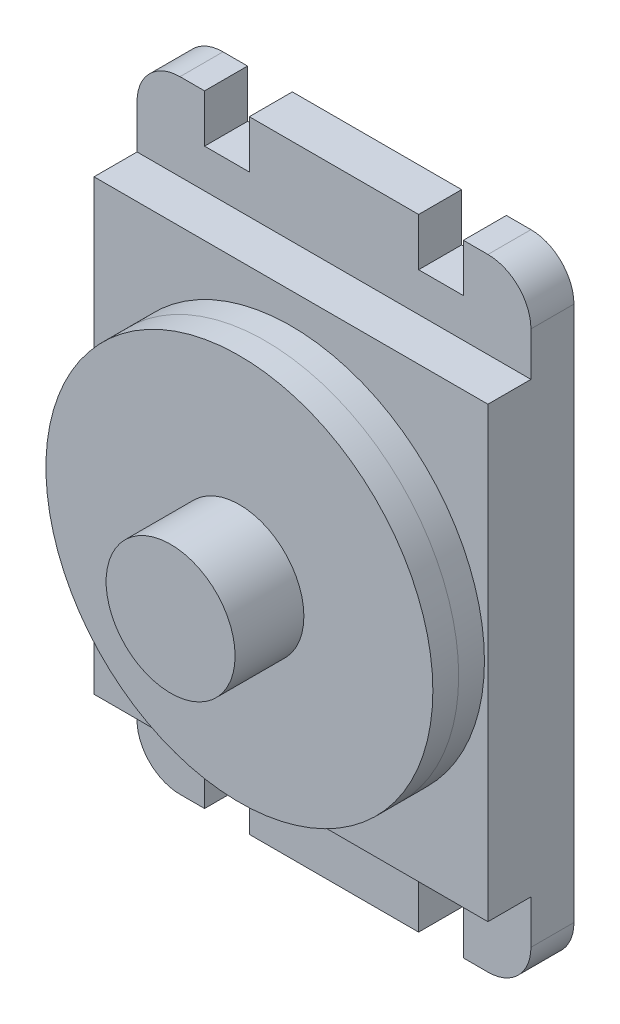
ISO-10303-21;
HEADER;
FILE_DESCRIPTION(('STEP AP214'),'2;1');
FILE_NAME('part.step','',(''),(''),'','','');
FILE_SCHEMA(('AUTOMOTIVE_DESIGN { 1 0 10303 214 1 1 1 1 }'));
ENDSEC;
DATA;
#1=APPLICATION_CONTEXT('core data for automotive mechanical design processes');
#2=APPLICATION_PROTOCOL_DEFINITION('international standard','automotive_design',2000,#1);
#3=PRODUCT_CONTEXT('',#1,'mechanical');
#4=PRODUCT('Part','Part','',(#3));
#5=PRODUCT_RELATED_PRODUCT_CATEGORY('part','',(#4));
#6=PRODUCT_DEFINITION_FORMATION('','',#4);
#7=PRODUCT_DEFINITION_CONTEXT('part definition',#1,'design');
#8=PRODUCT_DEFINITION('design','',#6,#7);
#9=PRODUCT_DEFINITION_SHAPE('','',#8);
#10=(LENGTH_UNIT() NAMED_UNIT(*) SI_UNIT(.MILLI.,.METRE.));
#11=(NAMED_UNIT(*) PLANE_ANGLE_UNIT() SI_UNIT($,.RADIAN.));
#12=(NAMED_UNIT(*) SI_UNIT($,.STERADIAN.) SOLID_ANGLE_UNIT());
#13=UNCERTAINTY_MEASURE_WITH_UNIT(LENGTH_MEASURE(1.E-05),#10,'distance_accuracy_value','');
#14=(GEOMETRIC_REPRESENTATION_CONTEXT(3) GLOBAL_UNCERTAINTY_ASSIGNED_CONTEXT((#13)) GLOBAL_UNIT_ASSIGNED_CONTEXT((#10,
#11,#12)) REPRESENTATION_CONTEXT('',''));
#15=CARTESIAN_POINT('',(0.,0.,0.));
#16=DIRECTION('',(0.,0.,1.));
#17=DIRECTION('',(1.,0.,0.));
#18=AXIS2_PLACEMENT_3D('',#15,#16,#17);
#19=CARTESIAN_POINT('',(-55.0000000000003,-2.19767780362812E-13,16.));
#20=DIRECTION('',(0.,0.,-1.));
#21=DIRECTION('',(-1.,0.,0.));
#22=AXIS2_PLACEMENT_3D('',#19,#20,#21);
#23=CYLINDRICAL_SURFACE('',#22,22.5);
#24=CARTESIAN_POINT('',(-55.0000000000003,-2.19767780362812E-13,16.));
#25=DIRECTION('',(0.,0.,1.));
#26=DIRECTION('',(1.,0.,0.));
#27=AXIS2_PLACEMENT_3D('',#24,#25,#26);
#28=CIRCLE('',#27,22.5);
#29=CARTESIAN_POINT('',(-32.5000000000003,-2.19767780362812E-13,16.));
#30=VERTEX_POINT('',#29);
#31=EDGE_CURVE('E51',#30,#30,#28,.T.);
#32=ORIENTED_EDGE('',*,*,#31,.F.);
#33=EDGE_LOOP('',(#32));
#34=FACE_BOUND('',#33,.T.);
#35=CARTESIAN_POINT('',(-55.0000000000003,-2.19767780362812E-13,13.));
#36=DIRECTION('',(0.,0.,1.));
#37=DIRECTION('',(1.,0.,0.));
#38=AXIS2_PLACEMENT_3D('',#35,#36,#37);
#39=CIRCLE('',#38,22.5);
#40=CARTESIAN_POINT('',(-32.5000000000003,-2.19767780362812E-13,13.));
#41=VERTEX_POINT('',#40);
#42=EDGE_CURVE('E47',#41,#41,#39,.T.);
#43=ORIENTED_EDGE('',*,*,#42,.T.);
#44=EDGE_LOOP('',(#43));
#45=FACE_BOUND('',#44,.T.);
#46=ADVANCED_FACE('F44',(#34,#45),#23,.T.);
#47=CARTESIAN_POINT('',(-55.0000000000003,-2.19767780362812E-13,16.));
#48=DIRECTION('',(0.,0.,1.));
#49=DIRECTION('',(1.,0.,0.));
#50=AXIS2_PLACEMENT_3D('',#47,#48,#49);
#51=PLANE('',#50);
#52=CARTESIAN_POINT('',(-55.0000000000003,-2.19767780362812E-13,16.));
#53=DIRECTION('',(0.,0.,1.));
#54=DIRECTION('',(1.,0.,0.));
#55=AXIS2_PLACEMENT_3D('',#52,#53,#54);
#56=CIRCLE('',#55,7.5);
#57=CARTESIAN_POINT('',(-47.5000000000003,-2.19767780362812E-13,16.));
#58=VERTEX_POINT('',#57);
#59=EDGE_CURVE('E11',#58,#58,#56,.T.);
#60=ORIENTED_EDGE('',*,*,#59,.F.);
#61=EDGE_LOOP('',(#60));
#62=FACE_BOUND('',#61,.T.);
#63=ORIENTED_EDGE('',*,*,#31,.T.);
#64=EDGE_LOOP('',(#63));
#65=FACE_BOUND('',#64,.T.);
#66=ADVANCED_FACE('F68',(#62,#65),#51,.T.);
#67=CARTESIAN_POINT('',(-55.0000000000003,-2.19767780362812E-13,13.));
#68=DIRECTION('',(0.,0.,1.));
#69=DIRECTION('',(1.,0.,0.));
#70=AXIS2_PLACEMENT_3D('',#67,#68,#69);
#71=PLANE('',#70);
#72=ORIENTED_EDGE('',*,*,#42,.F.);
#73=EDGE_LOOP('',(#72));
#74=FACE_BOUND('',#73,.T.);
#75=ADVANCED_FACE('F65',(#74),#71,.F.);
#76=CARTESIAN_POINT('',(-55.0000000000003,-2.19767780362812E-13,24.));
#77=DIRECTION('',(0.,0.,-1.));
#78=DIRECTION('',(-1.,0.,0.));
#79=AXIS2_PLACEMENT_3D('',#76,#77,#78);
#80=CYLINDRICAL_SURFACE('',#79,7.5);
#81=CARTESIAN_POINT('',(-55.0000000000003,-2.19767780362812E-13,24.));
#82=DIRECTION('',(0.,0.,1.));
#83=DIRECTION('',(1.,0.,0.));
#84=AXIS2_PLACEMENT_3D('',#81,#82,#83);
#85=CIRCLE('',#84,7.5);
#86=CARTESIAN_POINT('',(-47.5000000000003,-2.19767780362812E-13,24.));
#87=VERTEX_POINT('',#86);
#88=EDGE_CURVE('E57',#87,#87,#85,.T.);
#89=ORIENTED_EDGE('',*,*,#88,.F.);
#90=EDGE_LOOP('',(#89));
#91=FACE_BOUND('',#90,.T.);
#92=ORIENTED_EDGE('',*,*,#59,.T.);
#93=EDGE_LOOP('',(#92));
#94=FACE_BOUND('',#93,.T.);
#95=ADVANCED_FACE('F67',(#91,#94),#80,.T.);
#96=CARTESIAN_POINT('',(-55.0000000000003,-2.19767780362812E-13,24.));
#97=DIRECTION('',(0.,0.,1.));
#98=DIRECTION('',(1.,0.,0.));
#99=AXIS2_PLACEMENT_3D('',#96,#97,#98);
#100=PLANE('',#99);
#101=ORIENTED_EDGE('',*,*,#88,.T.);
#102=EDGE_LOOP('',(#101));
#103=FACE_BOUND('',#102,.T.);
#104=ADVANCED_FACE('F73',(#103),#100,.T.);
#105=CLOSED_SHELL('',(#46,#66,#75,#95,#104));
#106=MANIFOLD_SOLID_BREP('B2',#105);
#107=CARTESIAN_POINT('',(-37.0949203281673,31.1416620367931,5.));
#108=DIRECTION('',(0.,0.,1.));
#109=DIRECTION('',(1.,0.,0.));
#110=AXIS2_PLACEMENT_3D('',#107,#108,#109);
#111=PLANE('',#110);
#112=DIRECTION('',(1.,0.,0.));
#113=VECTOR('',#112,1.);
#114=CARTESIAN_POINT('',(-77.9050796718332,-26.0594506606891,5.));
#115=LINE('',#114,#113);
#116=CARTESIAN_POINT('',(-77.9050796718329,-26.0594506606891,5.));
#117=VERTEX_POINT('',#116);
#118=CARTESIAN_POINT('',(-32.0949203281673,-26.0594506606891,5.));
#119=VERTEX_POINT('',#118);
#120=EDGE_CURVE('E319',#117,#119,#115,.T.);
#121=ORIENTED_EDGE('',*,*,#120,.F.);
#122=DIRECTION('',(0.,-1.,0.));
#123=VECTOR('',#122,1.);
#124=CARTESIAN_POINT('',(-77.9050796718329,31.1416620367931,5.));
#125=LINE('',#124,#123);
#126=CARTESIAN_POINT('',(-77.9050796718329,-31.141662036793,5.));
#127=VERTEX_POINT('',#126);
#128=EDGE_CURVE('E339',#117,#127,#125,.T.);
#129=ORIENTED_EDGE('',*,*,#128,.T.);
#130=CARTESIAN_POINT('',(-72.9050796718329,-31.1416620367931,5.));
#131=DIRECTION('',(0.,0.,1.));
#132=DIRECTION('',(1.,0.,0.));
#133=AXIS2_PLACEMENT_3D('',#130,#131,#132);
#134=CIRCLE('',#133,5.);
#135=CARTESIAN_POINT('',(-72.9050796718329,-36.1416620367931,5.));
#136=VERTEX_POINT('',#135);
#137=EDGE_CURVE('E342',#127,#136,#134,.T.);
#138=ORIENTED_EDGE('',*,*,#137,.T.);
#139=DIRECTION('',(1.,0.,0.));
#140=VECTOR('',#139,1.);
#141=CARTESIAN_POINT('',(-72.9050796718329,-36.1416620367931,5.));
#142=LINE('',#141,#140);
#143=CARTESIAN_POINT('',(-70.0486055710375,-36.1416620367931,5.));
#144=VERTEX_POINT('',#143);
#145=EDGE_CURVE('E344',#136,#144,#142,.T.);
#146=ORIENTED_EDGE('',*,*,#145,.T.);
#147=DIRECTION('',(0.,1.,0.));
#148=VECTOR('',#147,1.);
#149=CARTESIAN_POINT('',(-70.0486055710375,-36.1416620367931,5.));
#150=LINE('',#149,#148);
#151=CARTESIAN_POINT('',(-70.0486055710375,-30.5715250808507,5.));
#152=VERTEX_POINT('',#151);
#153=EDGE_CURVE('E346',#144,#152,#150,.T.);
#154=ORIENTED_EDGE('',*,*,#153,.T.);
#155=DIRECTION('',(1.,0.,0.));
#156=VECTOR('',#155,1.);
#157=CARTESIAN_POINT('',(-70.0486055710375,-30.5715250808507,5.));
#158=LINE('',#157,#156);
#159=CARTESIAN_POINT('',(-64.8451738402919,-30.5715250808507,5.));
#160=VERTEX_POINT('',#159);
#161=EDGE_CURVE('E348',#152,#160,#158,.T.);
#162=ORIENTED_EDGE('',*,*,#161,.T.);
#163=DIRECTION('',(0.,-1.,0.));
#164=VECTOR('',#163,1.);
#165=CARTESIAN_POINT('',(-64.8451738402919,-30.5715250808507,5.));
#166=LINE('',#165,#164);
#167=CARTESIAN_POINT('',(-64.8451738402919,-36.1416620367931,5.));
#168=VERTEX_POINT('',#167);
#169=EDGE_CURVE('E350',#160,#168,#166,.T.);
#170=ORIENTED_EDGE('',*,*,#169,.T.);
#171=DIRECTION('',(1.,0.,0.));
#172=VECTOR('',#171,1.);
#173=CARTESIAN_POINT('',(-64.8451738402919,-36.1416620367931,5.));
#174=LINE('',#173,#172);
#175=CARTESIAN_POINT('',(-45.1548261597086,-36.1416620367931,5.));
#176=VERTEX_POINT('',#175);
#177=EDGE_CURVE('E352',#168,#176,#174,.T.);
#178=ORIENTED_EDGE('',*,*,#177,.T.);
#179=DIRECTION('',(0.,1.,0.));
#180=VECTOR('',#179,1.);
#181=CARTESIAN_POINT('',(-45.1548261597086,-30.5715250808507,5.));
#182=LINE('',#181,#180);
#183=CARTESIAN_POINT('',(-45.1548261597086,-30.5715250808507,5.));
#184=VERTEX_POINT('',#183);
#185=EDGE_CURVE('E354',#176,#184,#182,.T.);
#186=ORIENTED_EDGE('',*,*,#185,.T.);
#187=DIRECTION('',(1.,0.,0.));
#188=VECTOR('',#187,1.);
#189=CARTESIAN_POINT('',(-39.951394428963,-30.5715250808507,5.));
#190=LINE('',#189,#188);
#191=CARTESIAN_POINT('',(-39.951394428963,-30.5715250808507,5.));
#192=VERTEX_POINT('',#191);
#193=EDGE_CURVE('E356',#184,#192,#190,.T.);
#194=ORIENTED_EDGE('',*,*,#193,.T.);
#195=DIRECTION('',(0.,-1.,0.));
#196=VECTOR('',#195,1.);
#197=CARTESIAN_POINT('',(-39.951394428963,-36.1416620367931,5.));
#198=LINE('',#197,#196);
#199=CARTESIAN_POINT('',(-39.951394428963,-36.1416620367931,5.));
#200=VERTEX_POINT('',#199);
#201=EDGE_CURVE('E358',#192,#200,#198,.T.);
#202=ORIENTED_EDGE('',*,*,#201,.T.);
#203=DIRECTION('',(1.,0.,0.));
#204=VECTOR('',#203,1.);
#205=CARTESIAN_POINT('',(-39.951394428963,-36.1416620367931,5.));
#206=LINE('',#205,#204);
#207=CARTESIAN_POINT('',(-37.0949203281673,-36.1416620367931,5.));
#208=VERTEX_POINT('',#207);
#209=EDGE_CURVE('E360',#200,#208,#206,.T.);
#210=ORIENTED_EDGE('',*,*,#209,.T.);
#211=CARTESIAN_POINT('',(-37.0949203281673,-31.1416620367931,5.));
#212=DIRECTION('',(0.,0.,1.));
#213=DIRECTION('',(-1.,0.,0.));
#214=AXIS2_PLACEMENT_3D('',#211,#212,#213);
#215=CIRCLE('',#214,5.);
#216=CARTESIAN_POINT('',(-32.0949203281673,-31.1416620367931,5.));
#217=VERTEX_POINT('',#216);
#218=EDGE_CURVE('E362',#208,#217,#215,.T.);
#219=ORIENTED_EDGE('',*,*,#218,.T.);
#220=DIRECTION('',(0.,1.,0.));
#221=VECTOR('',#220,1.);
#222=CARTESIAN_POINT('',(-32.0949203281673,31.1416620367931,5.));
#223=LINE('',#222,#221);
#224=EDGE_CURVE('E138',#217,#119,#223,.T.);
#225=ORIENTED_EDGE('',*,*,#224,.T.);
#226=EDGE_LOOP('',(#121,#129,#138,#146,#154,#162,#170,#178,#186,#194,#202,#210,#219,#225));
#227=FACE_BOUND('',#226,.T.);
#228=ADVANCED_FACE('F115',(#227),#111,.T.);
#229=CARTESIAN_POINT('',(-72.9050796718329,36.1416620367931,5.));
#230=DIRECTION('',(0.,-1.,0.));
#231=DIRECTION('',(0.,0.,-1.));
#232=AXIS2_PLACEMENT_3D('',#229,#230,#231);
#233=PLANE('',#232);
#234=DIRECTION('',(-1.,0.,0.));
#235=VECTOR('',#234,1.);
#236=CARTESIAN_POINT('',(-72.9050796718329,36.1416620367931,0.));
#237=LINE('',#236,#235);
#238=CARTESIAN_POINT('',(-70.0486055710375,36.1416620367931,0.));
#239=VERTEX_POINT('',#238);
#240=CARTESIAN_POINT('',(-72.9050796718329,36.1416620367931,0.));
#241=VERTEX_POINT('',#240);
#242=EDGE_CURVE('E324',#239,#241,#237,.T.);
#243=ORIENTED_EDGE('',*,*,#242,.T.);
#244=DIRECTION('',(0.,0.,-1.));
#245=VECTOR('',#244,1.);
#246=CARTESIAN_POINT('',(-72.9050796718329,36.1416620367931,5.));
#247=LINE('',#246,#245);
#248=CARTESIAN_POINT('',(-72.9050796718329,36.1416620367931,5.));
#249=VERTEX_POINT('',#248);
#250=EDGE_CURVE('E496',#249,#241,#247,.T.);
#251=ORIENTED_EDGE('',*,*,#250,.F.);
#252=DIRECTION('',(-1.,0.,0.));
#253=VECTOR('',#252,1.);
#254=CARTESIAN_POINT('',(-72.9050796718329,36.1416620367931,5.));
#255=LINE('',#254,#253);
#256=CARTESIAN_POINT('',(-70.0486055710375,36.1416620367931,5.));
#257=VERTEX_POINT('',#256);
#258=EDGE_CURVE('E333',#257,#249,#255,.T.);
#259=ORIENTED_EDGE('',*,*,#258,.F.);
#260=DIRECTION('',(0.,0.,-1.));
#261=VECTOR('',#260,1.);
#262=CARTESIAN_POINT('',(-70.0486055710375,36.1416620367931,5.));
#263=LINE('',#262,#261);
#264=EDGE_CURVE('E382',#257,#239,#263,.T.);
#265=ORIENTED_EDGE('',*,*,#264,.T.);
#266=EDGE_LOOP('',(#243,#251,#259,#265));
#267=FACE_BOUND('',#266,.T.);
#268=ADVANCED_FACE('F117',(#267),#233,.F.);
#269=CARTESIAN_POINT('',(-72.9050796718329,31.1416620367931,5.));
#270=DIRECTION('',(0.,0.,-1.));
#271=DIRECTION('',(-1.,0.,0.));
#272=AXIS2_PLACEMENT_3D('',#269,#270,#271);
#273=CYLINDRICAL_SURFACE('',#272,5.);
#274=CARTESIAN_POINT('',(-72.9050796718329,31.1416620367931,0.));
#275=DIRECTION('',(0.,0.,1.));
#276=DIRECTION('',(1.,0.,0.));
#277=AXIS2_PLACEMENT_3D('',#274,#275,#276);
#278=CIRCLE('',#277,5.);
#279=CARTESIAN_POINT('',(-77.9050796718329,31.1416620367931,0.));
#280=VERTEX_POINT('',#279);
#281=EDGE_CURVE('E327',#241,#280,#278,.T.);
#282=ORIENTED_EDGE('',*,*,#281,.T.);
#283=DIRECTION('',(0.,0.,-1.));
#284=VECTOR('',#283,1.);
#285=CARTESIAN_POINT('',(-77.9050796718329,31.1416620367931,5.));
#286=LINE('',#285,#284);
#287=CARTESIAN_POINT('',(-77.9050796718329,31.1416620367931,5.));
#288=VERTEX_POINT('',#287);
#289=EDGE_CURVE('E493',#288,#280,#286,.T.);
#290=ORIENTED_EDGE('',*,*,#289,.F.);
#291=CARTESIAN_POINT('',(-72.9050796718329,31.1416620367931,5.));
#292=DIRECTION('',(0.,0.,1.));
#293=DIRECTION('',(1.,0.,0.));
#294=AXIS2_PLACEMENT_3D('',#291,#292,#293);
#295=CIRCLE('',#294,5.);
#296=EDGE_CURVE('E336',#249,#288,#295,.T.);
#297=ORIENTED_EDGE('',*,*,#296,.F.);
#298=ORIENTED_EDGE('',*,*,#250,.T.);
#299=EDGE_LOOP('',(#282,#290,#297,#298));
#300=FACE_BOUND('',#299,.T.);
#301=ADVANCED_FACE('F632',(#300),#273,.T.);
#302=CARTESIAN_POINT('',(-77.9050796718329,31.1416620367931,5.));
#303=DIRECTION('',(1.,0.,0.));
#304=DIRECTION('',(0.,1.,0.));
#305=AXIS2_PLACEMENT_3D('',#302,#303,#304);
#306=PLANE('',#305);
#307=DIRECTION('',(0.,-1.,0.));
#308=VECTOR('',#307,1.);
#309=CARTESIAN_POINT('',(-77.9050796718329,31.1416620367931,0.));
#310=LINE('',#309,#308);
#311=CARTESIAN_POINT('',(-77.9050796718329,-31.141662036793,0.));
#312=VERTEX_POINT('',#311);
#313=EDGE_CURVE('E385',#280,#312,#310,.T.);
#314=ORIENTED_EDGE('',*,*,#313,.T.);
#315=DIRECTION('',(0.,0.,-1.));
#316=VECTOR('',#315,1.);
#317=CARTESIAN_POINT('',(-77.9050796718329,-31.141662036793,5.));
#318=LINE('',#317,#316);
#319=EDGE_CURVE('E490',#127,#312,#318,.T.);
#320=ORIENTED_EDGE('',*,*,#319,.F.);
#321=ORIENTED_EDGE('',*,*,#128,.F.);
#322=DIRECTION('',(0.,0.,-1.));
#323=VECTOR('',#322,1.);
#324=CARTESIAN_POINT('',(-77.9050796718332,-26.0594506606891,10.));
#325=LINE('',#324,#323);
#326=CARTESIAN_POINT('',(-77.9050796718332,-26.0594506606891,10.));
#327=VERTEX_POINT('',#326);
#328=EDGE_CURVE('E329',#327,#117,#325,.T.);
#329=ORIENTED_EDGE('',*,*,#328,.F.);
#330=DIRECTION('',(0.,-1.,0.));
#331=VECTOR('',#330,1.);
#332=CARTESIAN_POINT('',(-77.9050796718332,26.0594506606887,10.));
#333=LINE('',#332,#331);
#334=CARTESIAN_POINT('',(-77.9050796718332,26.0594506606887,10.));
#335=VERTEX_POINT('',#334);
#336=EDGE_CURVE('E309',#335,#327,#333,.T.);
#337=ORIENTED_EDGE('',*,*,#336,.F.);
#338=DIRECTION('',(0.,0.,-1.));
#339=VECTOR('',#338,1.);
#340=CARTESIAN_POINT('',(-77.9050796718332,26.0594506606887,10.));
#341=LINE('',#340,#339);
#342=CARTESIAN_POINT('',(-77.9050796718332,26.0594506606887,5.));
#343=VERTEX_POINT('',#342);
#344=EDGE_CURVE('E306',#335,#343,#341,.T.);
#345=ORIENTED_EDGE('',*,*,#344,.T.);
#346=EDGE_CURVE('E340',#288,#343,#125,.T.);
#347=ORIENTED_EDGE('',*,*,#346,.F.);
#348=ORIENTED_EDGE('',*,*,#289,.T.);
#349=EDGE_LOOP('',(#314,#320,#321,#329,#337,#345,#347,#348));
#350=FACE_BOUND('',#349,.T.);
#351=ADVANCED_FACE('F521',(#350),#306,.F.);
#352=CARTESIAN_POINT('',(-72.9050796718329,-31.1416620367931,5.));
#353=DIRECTION('',(0.,0.,-1.));
#354=DIRECTION('',(-1.,0.,0.));
#355=AXIS2_PLACEMENT_3D('',#352,#353,#354);
#356=CYLINDRICAL_SURFACE('',#355,5.);
#357=CARTESIAN_POINT('',(-72.9050796718329,-31.1416620367931,0.));
#358=DIRECTION('',(0.,0.,1.));
#359=DIRECTION('',(1.,0.,0.));
#360=AXIS2_PLACEMENT_3D('',#357,#358,#359);
#361=CIRCLE('',#360,5.);
#362=CARTESIAN_POINT('',(-72.9050796718329,-36.1416620367931,0.));
#363=VERTEX_POINT('',#362);
#364=EDGE_CURVE('E387',#312,#363,#361,.T.);
#365=ORIENTED_EDGE('',*,*,#364,.T.);
#366=DIRECTION('',(0.,0.,-1.));
#367=VECTOR('',#366,1.);
#368=CARTESIAN_POINT('',(-72.9050796718329,-36.1416620367931,5.));
#369=LINE('',#368,#367);
#370=EDGE_CURVE('E487',#136,#363,#369,.T.);
#371=ORIENTED_EDGE('',*,*,#370,.F.);
#372=ORIENTED_EDGE('',*,*,#137,.F.);
#373=ORIENTED_EDGE('',*,*,#319,.T.);
#374=EDGE_LOOP('',(#365,#371,#372,#373));
#375=FACE_BOUND('',#374,.T.);
#376=ADVANCED_FACE('F528',(#375),#356,.T.);
#377=CARTESIAN_POINT('',(-72.9050796718329,-36.1416620367931,5.));
#378=DIRECTION('',(0.,1.,0.));
#379=DIRECTION('',(0.,0.,1.));
#380=AXIS2_PLACEMENT_3D('',#377,#378,#379);
#381=PLANE('',#380);
#382=DIRECTION('',(1.,0.,0.));
#383=VECTOR('',#382,1.);
#384=CARTESIAN_POINT('',(-72.9050796718329,-36.1416620367931,0.));
#385=LINE('',#384,#383);
#386=CARTESIAN_POINT('',(-70.0486055710375,-36.1416620367931,0.));
#387=VERTEX_POINT('',#386);
#388=EDGE_CURVE('E389',#363,#387,#385,.T.);
#389=ORIENTED_EDGE('',*,*,#388,.T.);
#390=DIRECTION('',(0.,0.,-1.));
#391=VECTOR('',#390,1.);
#392=CARTESIAN_POINT('',(-70.0486055710375,-36.1416620367931,5.));
#393=LINE('',#392,#391);
#394=EDGE_CURVE('E484',#144,#387,#393,.T.);
#395=ORIENTED_EDGE('',*,*,#394,.F.);
#396=ORIENTED_EDGE('',*,*,#145,.F.);
#397=ORIENTED_EDGE('',*,*,#370,.T.);
#398=EDGE_LOOP('',(#389,#395,#396,#397));
#399=FACE_BOUND('',#398,.T.);
#400=ADVANCED_FACE('F532',(#399),#381,.F.);
#401=CARTESIAN_POINT('',(-70.0486055710375,-36.1416620367931,5.));
#402=DIRECTION('',(-1.,0.,0.));
#403=DIRECTION('',(0.,-1.,0.));
#404=AXIS2_PLACEMENT_3D('',#401,#402,#403);
#405=PLANE('',#404);
#406=DIRECTION('',(0.,1.,0.));
#407=VECTOR('',#406,1.);
#408=CARTESIAN_POINT('',(-70.0486055710375,-36.1416620367931,0.));
#409=LINE('',#408,#407);
#410=CARTESIAN_POINT('',(-70.0486055710375,-30.5715250808507,0.));
#411=VERTEX_POINT('',#410);
#412=EDGE_CURVE('E391',#387,#411,#409,.T.);
#413=ORIENTED_EDGE('',*,*,#412,.T.);
#414=DIRECTION('',(0.,0.,-1.));
#415=VECTOR('',#414,1.);
#416=CARTESIAN_POINT('',(-70.0486055710375,-30.5715250808507,5.));
#417=LINE('',#416,#415);
#418=EDGE_CURVE('E481',#152,#411,#417,.T.);
#419=ORIENTED_EDGE('',*,*,#418,.F.);
#420=ORIENTED_EDGE('',*,*,#153,.F.);
#421=ORIENTED_EDGE('',*,*,#394,.T.);
#422=EDGE_LOOP('',(#413,#419,#420,#421));
#423=FACE_BOUND('',#422,.T.);
#424=ADVANCED_FACE('F537',(#423),#405,.F.);
#425=CARTESIAN_POINT('',(-70.0486055710375,-30.5715250808507,5.));
#426=DIRECTION('',(0.,1.,0.));
#427=DIRECTION('',(0.,0.,1.));
#428=AXIS2_PLACEMENT_3D('',#425,#426,#427);
#429=PLANE('',#428);
#430=DIRECTION('',(1.,0.,0.));
#431=VECTOR('',#430,1.);
#432=CARTESIAN_POINT('',(-70.0486055710375,-30.5715250808507,0.));
#433=LINE('',#432,#431);
#434=CARTESIAN_POINT('',(-64.8451738402919,-30.5715250808507,0.));
#435=VERTEX_POINT('',#434);
#436=EDGE_CURVE('E393',#411,#435,#433,.T.);
#437=ORIENTED_EDGE('',*,*,#436,.T.);
#438=DIRECTION('',(0.,0.,-1.));
#439=VECTOR('',#438,1.);
#440=CARTESIAN_POINT('',(-64.8451738402919,-30.5715250808507,5.));
#441=LINE('',#440,#439);
#442=EDGE_CURVE('E478',#160,#435,#441,.T.);
#443=ORIENTED_EDGE('',*,*,#442,.F.);
#444=ORIENTED_EDGE('',*,*,#161,.F.);
#445=ORIENTED_EDGE('',*,*,#418,.T.);
#446=EDGE_LOOP('',(#437,#443,#444,#445));
#447=FACE_BOUND('',#446,.T.);
#448=ADVANCED_FACE('F543',(#447),#429,.F.);
#449=CARTESIAN_POINT('',(-64.8451738402919,-30.5715250808507,5.));
#450=DIRECTION('',(1.,0.,0.));
#451=DIRECTION('',(0.,0.,-1.));
#452=AXIS2_PLACEMENT_3D('',#449,#450,#451);
#453=PLANE('',#452);
#454=DIRECTION('',(0.,-1.,0.));
#455=VECTOR('',#454,1.);
#456=CARTESIAN_POINT('',(-64.8451738402919,-30.5715250808507,0.));
#457=LINE('',#456,#455);
#458=CARTESIAN_POINT('',(-64.8451738402919,-36.1416620367931,0.));
#459=VERTEX_POINT('',#458);
#460=EDGE_CURVE('E395',#435,#459,#457,.T.);
#461=ORIENTED_EDGE('',*,*,#460,.T.);
#462=DIRECTION('',(0.,0.,-1.));
#463=VECTOR('',#462,1.);
#464=CARTESIAN_POINT('',(-64.8451738402919,-36.1416620367931,5.));
#465=LINE('',#464,#463);
#466=EDGE_CURVE('E475',#168,#459,#465,.T.);
#467=ORIENTED_EDGE('',*,*,#466,.F.);
#468=ORIENTED_EDGE('',*,*,#169,.F.);
#469=ORIENTED_EDGE('',*,*,#442,.T.);
#470=EDGE_LOOP('',(#461,#467,#468,#469));
#471=FACE_BOUND('',#470,.T.);
#472=ADVANCED_FACE('F547',(#471),#453,.F.);
#473=CARTESIAN_POINT('',(-64.8451738402919,-36.1416620367931,5.));
#474=DIRECTION('',(0.,1.,0.));
#475=DIRECTION('',(0.,0.,1.));
#476=AXIS2_PLACEMENT_3D('',#473,#474,#475);
#477=PLANE('',#476);
#478=DIRECTION('',(1.,0.,0.));
#479=VECTOR('',#478,1.);
#480=CARTESIAN_POINT('',(-64.8451738402919,-36.1416620367931,0.));
#481=LINE('',#480,#479);
#482=CARTESIAN_POINT('',(-45.1548261597086,-36.1416620367931,0.));
#483=VERTEX_POINT('',#482);
#484=EDGE_CURVE('E397',#459,#483,#481,.T.);
#485=ORIENTED_EDGE('',*,*,#484,.T.);
#486=DIRECTION('',(0.,0.,-1.));
#487=VECTOR('',#486,1.);
#488=CARTESIAN_POINT('',(-45.1548261597086,-36.1416620367931,5.));
#489=LINE('',#488,#487);
#490=EDGE_CURVE('E472',#176,#483,#489,.T.);
#491=ORIENTED_EDGE('',*,*,#490,.F.);
#492=ORIENTED_EDGE('',*,*,#177,.F.);
#493=ORIENTED_EDGE('',*,*,#466,.T.);
#494=EDGE_LOOP('',(#485,#491,#492,#493));
#495=FACE_BOUND('',#494,.T.);
#496=ADVANCED_FACE('F552',(#495),#477,.F.);
#497=CARTESIAN_POINT('',(-45.1548261597086,-30.5715250808507,5.));
#498=DIRECTION('',(-1.,0.,0.));
#499=DIRECTION('',(0.,0.,1.));
#500=AXIS2_PLACEMENT_3D('',#497,#498,#499);
#501=PLANE('',#500);
#502=DIRECTION('',(0.,1.,0.));
#503=VECTOR('',#502,1.);
#504=CARTESIAN_POINT('',(-45.1548261597086,-30.5715250808507,0.));
#505=LINE('',#504,#503);
#506=CARTESIAN_POINT('',(-45.1548261597086,-30.5715250808507,0.));
#507=VERTEX_POINT('',#506);
#508=EDGE_CURVE('E399',#483,#507,#505,.T.);
#509=ORIENTED_EDGE('',*,*,#508,.T.);
#510=DIRECTION('',(0.,0.,-1.));
#511=VECTOR('',#510,1.);
#512=CARTESIAN_POINT('',(-45.1548261597086,-30.5715250808507,5.));
#513=LINE('',#512,#511);
#514=EDGE_CURVE('E469',#184,#507,#513,.T.);
#515=ORIENTED_EDGE('',*,*,#514,.F.);
#516=ORIENTED_EDGE('',*,*,#185,.F.);
#517=ORIENTED_EDGE('',*,*,#490,.T.);
#518=EDGE_LOOP('',(#509,#515,#516,#517));
#519=FACE_BOUND('',#518,.T.);
#520=ADVANCED_FACE('F558',(#519),#501,.F.);
#521=CARTESIAN_POINT('',(-39.951394428963,-30.5715250808507,5.));
#522=DIRECTION('',(0.,1.,0.));
#523=DIRECTION('',(0.,0.,1.));
#524=AXIS2_PLACEMENT_3D('',#521,#522,#523);
#525=PLANE('',#524);
#526=DIRECTION('',(1.,0.,0.));
#527=VECTOR('',#526,1.);
#528=CARTESIAN_POINT('',(-39.951394428963,-30.5715250808507,0.));
#529=LINE('',#528,#527);
#530=CARTESIAN_POINT('',(-39.951394428963,-30.5715250808507,0.));
#531=VERTEX_POINT('',#530);
#532=EDGE_CURVE('E401',#507,#531,#529,.T.);
#533=ORIENTED_EDGE('',*,*,#532,.T.);
#534=DIRECTION('',(0.,0.,-1.));
#535=VECTOR('',#534,1.);
#536=CARTESIAN_POINT('',(-39.951394428963,-30.5715250808507,5.));
#537=LINE('',#536,#535);
#538=EDGE_CURVE('E466',#192,#531,#537,.T.);
#539=ORIENTED_EDGE('',*,*,#538,.F.);
#540=ORIENTED_EDGE('',*,*,#193,.F.);
#541=ORIENTED_EDGE('',*,*,#514,.T.);
#542=EDGE_LOOP('',(#533,#539,#540,#541));
#543=FACE_BOUND('',#542,.T.);
#544=ADVANCED_FACE('F562',(#543),#525,.F.);
#545=CARTESIAN_POINT('',(-39.951394428963,-36.1416620367931,5.));
#546=DIRECTION('',(1.,0.,0.));
#547=DIRECTION('',(0.,0.,-1.));
#548=AXIS2_PLACEMENT_3D('',#545,#546,#547);
#549=PLANE('',#548);
#550=DIRECTION('',(0.,-1.,0.));
#551=VECTOR('',#550,1.);
#552=CARTESIAN_POINT('',(-39.951394428963,-36.1416620367931,0.));
#553=LINE('',#552,#551);
#554=CARTESIAN_POINT('',(-39.951394428963,-36.1416620367931,0.));
#555=VERTEX_POINT('',#554);
#556=EDGE_CURVE('E403',#531,#555,#553,.T.);
#557=ORIENTED_EDGE('',*,*,#556,.T.);
#558=DIRECTION('',(0.,0.,-1.));
#559=VECTOR('',#558,1.);
#560=CARTESIAN_POINT('',(-39.951394428963,-36.1416620367931,5.));
#561=LINE('',#560,#559);
#562=EDGE_CURVE('E463',#200,#555,#561,.T.);
#563=ORIENTED_EDGE('',*,*,#562,.F.);
#564=ORIENTED_EDGE('',*,*,#201,.F.);
#565=ORIENTED_EDGE('',*,*,#538,.T.);
#566=EDGE_LOOP('',(#557,#563,#564,#565));
#567=FACE_BOUND('',#566,.T.);
#568=ADVANCED_FACE('F567',(#567),#549,.F.);
#569=CARTESIAN_POINT('',(-39.951394428963,-36.1416620367931,5.));
#570=DIRECTION('',(0.,1.,0.));
#571=DIRECTION('',(0.,0.,1.));
#572=AXIS2_PLACEMENT_3D('',#569,#570,#571);
#573=PLANE('',#572);
#574=DIRECTION('',(1.,0.,0.));
#575=VECTOR('',#574,1.);
#576=CARTESIAN_POINT('',(-39.951394428963,-36.1416620367931,0.));
#577=LINE('',#576,#575);
#578=CARTESIAN_POINT('',(-37.0949203281673,-36.1416620367931,0.));
#579=VERTEX_POINT('',#578);
#580=EDGE_CURVE('E405',#555,#579,#577,.T.);
#581=ORIENTED_EDGE('',*,*,#580,.T.);
#582=DIRECTION('',(0.,0.,-1.));
#583=VECTOR('',#582,1.);
#584=CARTESIAN_POINT('',(-37.0949203281673,-36.1416620367931,5.));
#585=LINE('',#584,#583);
#586=EDGE_CURVE('E460',#208,#579,#585,.T.);
#587=ORIENTED_EDGE('',*,*,#586,.F.);
#588=ORIENTED_EDGE('',*,*,#209,.F.);
#589=ORIENTED_EDGE('',*,*,#562,.T.);
#590=EDGE_LOOP('',(#581,#587,#588,#589));
#591=FACE_BOUND('',#590,.T.);
#592=ADVANCED_FACE('F573',(#591),#573,.F.);
#593=CARTESIAN_POINT('',(-37.0949203281673,-31.1416620367931,5.));
#594=DIRECTION('',(0.,0.,-1.));
#595=DIRECTION('',(-1.,0.,0.));
#596=AXIS2_PLACEMENT_3D('',#593,#594,#595);
#597=CYLINDRICAL_SURFACE('',#596,5.);
#598=CARTESIAN_POINT('',(-37.0949203281673,-31.1416620367931,0.));
#599=DIRECTION('',(0.,0.,1.));
#600=DIRECTION('',(-1.,0.,0.));
#601=AXIS2_PLACEMENT_3D('',#598,#599,#600);
#602=CIRCLE('',#601,5.);
#603=CARTESIAN_POINT('',(-32.0949203281673,-31.1416620367931,0.));
#604=VERTEX_POINT('',#603);
#605=EDGE_CURVE('E407',#579,#604,#602,.T.);
#606=ORIENTED_EDGE('',*,*,#605,.T.);
#607=DIRECTION('',(0.,0.,-1.));
#608=VECTOR('',#607,1.);
#609=CARTESIAN_POINT('',(-32.0949203281673,-31.1416620367931,5.));
#610=LINE('',#609,#608);
#611=EDGE_CURVE('E457',#217,#604,#610,.T.);
#612=ORIENTED_EDGE('',*,*,#611,.F.);
#613=ORIENTED_EDGE('',*,*,#218,.F.);
#614=ORIENTED_EDGE('',*,*,#586,.T.);
#615=EDGE_LOOP('',(#606,#612,#613,#614));
#616=FACE_BOUND('',#615,.T.);
#617=ADVANCED_FACE('F577',(#616),#597,.T.);
#618=CARTESIAN_POINT('',(-32.0949203281673,31.1416620367931,5.));
#619=DIRECTION('',(-1.,0.,0.));
#620=DIRECTION('',(0.,0.,1.));
#621=AXIS2_PLACEMENT_3D('',#618,#619,#620);
#622=PLANE('',#621);
#623=DIRECTION('',(0.,1.,0.));
#624=VECTOR('',#623,1.);
#625=CARTESIAN_POINT('',(-32.0949203281673,31.1416620367931,0.));
#626=LINE('',#625,#624);
#627=CARTESIAN_POINT('',(-32.0949203281673,31.1416620367931,0.));
#628=VERTEX_POINT('',#627);
#629=EDGE_CURVE('E409',#604,#628,#626,.T.);
#630=ORIENTED_EDGE('',*,*,#629,.T.);
#631=DIRECTION('',(0.,0.,-1.));
#632=VECTOR('',#631,1.);
#633=CARTESIAN_POINT('',(-32.0949203281673,31.1416620367931,5.));
#634=LINE('',#633,#632);
#635=CARTESIAN_POINT('',(-32.0949203281673,31.1416620367931,5.));
#636=VERTEX_POINT('',#635);
#637=EDGE_CURVE('E454',#636,#628,#634,.T.);
#638=ORIENTED_EDGE('',*,*,#637,.F.);
#639=CARTESIAN_POINT('',(-32.0949203281673,26.0594506606887,5.));
#640=VERTEX_POINT('',#639);
#641=EDGE_CURVE('E323',#640,#636,#223,.T.);
#642=ORIENTED_EDGE('',*,*,#641,.F.);
#643=DIRECTION('',(0.,0.,-1.));
#644=VECTOR('',#643,1.);
#645=CARTESIAN_POINT('',(-32.0949203281673,26.0594506606887,10.));
#646=LINE('',#645,#644);
#647=CARTESIAN_POINT('',(-32.0949203281673,26.0594506606887,10.));
#648=VERTEX_POINT('',#647);
#649=EDGE_CURVE('E304',#648,#640,#646,.T.);
#650=ORIENTED_EDGE('',*,*,#649,.F.);
#651=DIRECTION('',(0.,1.,0.));
#652=VECTOR('',#651,1.);
#653=CARTESIAN_POINT('',(-32.0949203281673,26.0594506606887,10.));
#654=LINE('',#653,#652);
#655=CARTESIAN_POINT('',(-32.0949203281673,-26.0594506606891,10.));
#656=VERTEX_POINT('',#655);
#657=EDGE_CURVE('E310',#656,#648,#654,.T.);
#658=ORIENTED_EDGE('',*,*,#657,.F.);
#659=DIRECTION('',(0.,0.,-1.));
#660=VECTOR('',#659,1.);
#661=CARTESIAN_POINT('',(-32.0949203281673,-26.0594506606891,10.));
#662=LINE('',#661,#660);
#663=EDGE_CURVE('E512',#656,#119,#662,.T.);
#664=ORIENTED_EDGE('',*,*,#663,.T.);
#665=ORIENTED_EDGE('',*,*,#224,.F.);
#666=ORIENTED_EDGE('',*,*,#611,.T.);
#667=EDGE_LOOP('',(#630,#638,#642,#650,#658,#664,#665,#666));
#668=FACE_BOUND('',#667,.T.);
#669=ADVANCED_FACE('F321',(#668),#622,.F.);
#670=CARTESIAN_POINT('',(-37.0949203281673,31.1416620367931,5.));
#671=DIRECTION('',(0.,0.,-1.));
#672=DIRECTION('',(-1.,0.,0.));
#673=AXIS2_PLACEMENT_3D('',#670,#671,#672);
#674=CYLINDRICAL_SURFACE('',#673,5.);
#675=CARTESIAN_POINT('',(-37.0949203281673,31.1416620367931,0.));
#676=DIRECTION('',(0.,0.,1.));
#677=DIRECTION('',(1.,0.,0.));
#678=AXIS2_PLACEMENT_3D('',#675,#676,#677);
#679=CIRCLE('',#678,5.);
#680=CARTESIAN_POINT('',(-37.0949203281673,36.1416620367931,0.));
#681=VERTEX_POINT('',#680);
#682=EDGE_CURVE('E411',#628,#681,#679,.T.);
#683=ORIENTED_EDGE('',*,*,#682,.T.);
#684=DIRECTION('',(0.,0.,-1.));
#685=VECTOR('',#684,1.);
#686=CARTESIAN_POINT('',(-37.0949203281673,36.1416620367931,5.));
#687=LINE('',#686,#685);
#688=CARTESIAN_POINT('',(-37.0949203281673,36.1416620367931,5.));
#689=VERTEX_POINT('',#688);
#690=EDGE_CURVE('E451',#689,#681,#687,.T.);
#691=ORIENTED_EDGE('',*,*,#690,.F.);
#692=CARTESIAN_POINT('',(-37.0949203281673,31.1416620367931,5.));
#693=DIRECTION('',(0.,0.,1.));
#694=DIRECTION('',(1.,0.,0.));
#695=AXIS2_PLACEMENT_3D('',#692,#693,#694);
#696=CIRCLE('',#695,5.);
#697=EDGE_CURVE('E365',#636,#689,#696,.T.);
#698=ORIENTED_EDGE('',*,*,#697,.F.);
#699=ORIENTED_EDGE('',*,*,#637,.T.);
#700=EDGE_LOOP('',(#683,#691,#698,#699));
#701=FACE_BOUND('',#700,.T.);
#702=ADVANCED_FACE('F587',(#701),#674,.T.);
#703=CARTESIAN_POINT('',(-39.951394428963,36.1416620367931,5.));
#704=DIRECTION('',(0.,-1.,0.));
#705=DIRECTION('',(1.,0.,0.));
#706=AXIS2_PLACEMENT_3D('',#703,#704,#705);
#707=PLANE('',#706);
#708=DIRECTION('',(-1.,0.,0.));
#709=VECTOR('',#708,1.);
#710=CARTESIAN_POINT('',(-39.951394428963,36.1416620367931,0.));
#711=LINE('',#710,#709);
#712=CARTESIAN_POINT('',(-39.951394428963,36.1416620367931,0.));
#713=VERTEX_POINT('',#712);
#714=EDGE_CURVE('E413',#681,#713,#711,.T.);
#715=ORIENTED_EDGE('',*,*,#714,.T.);
#716=DIRECTION('',(0.,0.,-1.));
#717=VECTOR('',#716,1.);
#718=CARTESIAN_POINT('',(-39.951394428963,36.1416620367931,5.));
#719=LINE('',#718,#717);
#720=CARTESIAN_POINT('',(-39.951394428963,36.1416620367931,5.));
#721=VERTEX_POINT('',#720);
#722=EDGE_CURVE('E448',#721,#713,#719,.T.);
#723=ORIENTED_EDGE('',*,*,#722,.F.);
#724=DIRECTION('',(-1.,0.,0.));
#725=VECTOR('',#724,1.);
#726=CARTESIAN_POINT('',(-39.951394428963,36.1416620367931,5.));
#727=LINE('',#726,#725);
#728=EDGE_CURVE('E367',#689,#721,#727,.T.);
#729=ORIENTED_EDGE('',*,*,#728,.F.);
#730=ORIENTED_EDGE('',*,*,#690,.T.);
#731=EDGE_LOOP('',(#715,#723,#729,#730));
#732=FACE_BOUND('',#731,.T.);
#733=ADVANCED_FACE('F591',(#732),#707,.F.);
#734=CARTESIAN_POINT('',(-39.951394428963,30.5715250808507,5.));
#735=DIRECTION('',(1.,0.,0.));
#736=DIRECTION('',(0.,0.,-1.));
#737=AXIS2_PLACEMENT_3D('',#734,#735,#736);
#738=PLANE('',#737);
#739=DIRECTION('',(0.,-1.,0.));
#740=VECTOR('',#739,1.);
#741=CARTESIAN_POINT('',(-39.951394428963,30.5715250808507,0.));
#742=LINE('',#741,#740);
#743=CARTESIAN_POINT('',(-39.951394428963,30.5715250808507,0.));
#744=VERTEX_POINT('',#743);
#745=EDGE_CURVE('E415',#713,#744,#742,.T.);
#746=ORIENTED_EDGE('',*,*,#745,.T.);
#747=DIRECTION('',(0.,0.,-1.));
#748=VECTOR('',#747,1.);
#749=CARTESIAN_POINT('',(-39.951394428963,30.5715250808507,5.));
#750=LINE('',#749,#748);
#751=CARTESIAN_POINT('',(-39.951394428963,30.5715250808507,5.));
#752=VERTEX_POINT('',#751);
#753=EDGE_CURVE('E445',#752,#744,#750,.T.);
#754=ORIENTED_EDGE('',*,*,#753,.F.);
#755=DIRECTION('',(0.,-1.,0.));
#756=VECTOR('',#755,1.);
#757=CARTESIAN_POINT('',(-39.951394428963,30.5715250808507,5.));
#758=LINE('',#757,#756);
#759=EDGE_CURVE('E369',#721,#752,#758,.T.);
#760=ORIENTED_EDGE('',*,*,#759,.F.);
#761=ORIENTED_EDGE('',*,*,#722,.T.);
#762=EDGE_LOOP('',(#746,#754,#760,#761));
#763=FACE_BOUND('',#762,.T.);
#764=ADVANCED_FACE('F599',(#763),#738,.F.);
#765=CARTESIAN_POINT('',(-39.951394428963,30.5715250808507,5.));
#766=DIRECTION('',(0.,-1.,0.));
#767=DIRECTION('',(0.,0.,-1.));
#768=AXIS2_PLACEMENT_3D('',#765,#766,#767);
#769=PLANE('',#768);
#770=DIRECTION('',(-1.,0.,0.));
#771=VECTOR('',#770,1.);
#772=CARTESIAN_POINT('',(-39.951394428963,30.5715250808507,0.));
#773=LINE('',#772,#771);
#774=CARTESIAN_POINT('',(-45.1548261597086,30.5715250808507,0.));
#775=VERTEX_POINT('',#774);
#776=EDGE_CURVE('E417',#744,#775,#773,.T.);
#777=ORIENTED_EDGE('',*,*,#776,.T.);
#778=DIRECTION('',(0.,0.,-1.));
#779=VECTOR('',#778,1.);
#780=CARTESIAN_POINT('',(-45.1548261597086,30.5715250808507,5.));
#781=LINE('',#780,#779);
#782=CARTESIAN_POINT('',(-45.1548261597086,30.5715250808507,5.));
#783=VERTEX_POINT('',#782);
#784=EDGE_CURVE('E442',#783,#775,#781,.T.);
#785=ORIENTED_EDGE('',*,*,#784,.F.);
#786=DIRECTION('',(-1.,0.,0.));
#787=VECTOR('',#786,1.);
#788=CARTESIAN_POINT('',(-39.951394428963,30.5715250808507,5.));
#789=LINE('',#788,#787);
#790=EDGE_CURVE('E371',#752,#783,#789,.T.);
#791=ORIENTED_EDGE('',*,*,#790,.F.);
#792=ORIENTED_EDGE('',*,*,#753,.T.);
#793=EDGE_LOOP('',(#777,#785,#791,#792));
#794=FACE_BOUND('',#793,.T.);
#795=ADVANCED_FACE('F602',(#794),#769,.F.);
#796=CARTESIAN_POINT('',(-45.1548261597086,30.5715250808507,5.));
#797=DIRECTION('',(-1.,0.,0.));
#798=DIRECTION('',(0.,0.,1.));
#799=AXIS2_PLACEMENT_3D('',#796,#797,#798);
#800=PLANE('',#799);
#801=DIRECTION('',(0.,1.,0.));
#802=VECTOR('',#801,1.);
#803=CARTESIAN_POINT('',(-45.1548261597086,30.5715250808507,0.));
#804=LINE('',#803,#802);
#805=CARTESIAN_POINT('',(-45.1548261597086,36.1416620367931,0.));
#806=VERTEX_POINT('',#805);
#807=EDGE_CURVE('E419',#775,#806,#804,.T.);
#808=ORIENTED_EDGE('',*,*,#807,.T.);
#809=DIRECTION('',(0.,0.,-1.));
#810=VECTOR('',#809,1.);
#811=CARTESIAN_POINT('',(-45.1548261597086,36.1416620367931,5.));
#812=LINE('',#811,#810);
#813=CARTESIAN_POINT('',(-45.1548261597086,36.1416620367931,5.));
#814=VERTEX_POINT('',#813);
#815=EDGE_CURVE('E439',#814,#806,#812,.T.);
#816=ORIENTED_EDGE('',*,*,#815,.F.);
#817=DIRECTION('',(0.,1.,0.));
#818=VECTOR('',#817,1.);
#819=CARTESIAN_POINT('',(-45.1548261597086,30.5715250808507,5.));
#820=LINE('',#819,#818);
#821=EDGE_CURVE('E373',#783,#814,#820,.T.);
#822=ORIENTED_EDGE('',*,*,#821,.F.);
#823=ORIENTED_EDGE('',*,*,#784,.T.);
#824=EDGE_LOOP('',(#808,#816,#822,#823));
#825=FACE_BOUND('',#824,.T.);
#826=ADVANCED_FACE('F607',(#825),#800,.F.);
#827=CARTESIAN_POINT('',(-64.8451738402919,36.1416620367931,5.));
#828=DIRECTION('',(0.,-1.,0.));
#829=DIRECTION('',(0.,0.,-1.));
#830=AXIS2_PLACEMENT_3D('',#827,#828,#829);
#831=PLANE('',#830);
#832=DIRECTION('',(-1.,0.,0.));
#833=VECTOR('',#832,1.);
#834=CARTESIAN_POINT('',(-64.8451738402919,36.1416620367931,0.));
#835=LINE('',#834,#833);
#836=CARTESIAN_POINT('',(-64.8451738402919,36.1416620367931,0.));
#837=VERTEX_POINT('',#836);
#838=EDGE_CURVE('E421',#806,#837,#835,.T.);
#839=ORIENTED_EDGE('',*,*,#838,.T.);
#840=DIRECTION('',(0.,0.,-1.));
#841=VECTOR('',#840,1.);
#842=CARTESIAN_POINT('',(-64.8451738402919,36.1416620367931,5.));
#843=LINE('',#842,#841);
#844=CARTESIAN_POINT('',(-64.8451738402919,36.1416620367931,5.));
#845=VERTEX_POINT('',#844);
#846=EDGE_CURVE('E436',#845,#837,#843,.T.);
#847=ORIENTED_EDGE('',*,*,#846,.F.);
#848=DIRECTION('',(-1.,0.,0.));
#849=VECTOR('',#848,1.);
#850=CARTESIAN_POINT('',(-64.8451738402919,36.1416620367931,5.));
#851=LINE('',#850,#849);
#852=EDGE_CURVE('E375',#814,#845,#851,.T.);
#853=ORIENTED_EDGE('',*,*,#852,.F.);
#854=ORIENTED_EDGE('',*,*,#815,.T.);
#855=EDGE_LOOP('',(#839,#847,#853,#854));
#856=FACE_BOUND('',#855,.T.);
#857=ADVANCED_FACE('F613',(#856),#831,.F.);
#858=CARTESIAN_POINT('',(-64.8451738402919,30.5715250808507,5.));
#859=DIRECTION('',(1.,0.,0.));
#860=DIRECTION('',(0.,0.,-1.));
#861=AXIS2_PLACEMENT_3D('',#858,#859,#860);
#862=PLANE('',#861);
#863=DIRECTION('',(0.,-1.,0.));
#864=VECTOR('',#863,1.);
#865=CARTESIAN_POINT('',(-64.8451738402919,30.5715250808507,0.));
#866=LINE('',#865,#864);
#867=CARTESIAN_POINT('',(-64.8451738402919,30.5715250808507,0.));
#868=VERTEX_POINT('',#867);
#869=EDGE_CURVE('E423',#837,#868,#866,.T.);
#870=ORIENTED_EDGE('',*,*,#869,.T.);
#871=DIRECTION('',(0.,0.,-1.));
#872=VECTOR('',#871,1.);
#873=CARTESIAN_POINT('',(-64.8451738402919,30.5715250808507,5.));
#874=LINE('',#873,#872);
#875=CARTESIAN_POINT('',(-64.8451738402919,30.5715250808507,5.));
#876=VERTEX_POINT('',#875);
#877=EDGE_CURVE('E433',#876,#868,#874,.T.);
#878=ORIENTED_EDGE('',*,*,#877,.F.);
#879=DIRECTION('',(0.,-1.,0.));
#880=VECTOR('',#879,1.);
#881=CARTESIAN_POINT('',(-64.8451738402919,30.5715250808507,5.));
#882=LINE('',#881,#880);
#883=EDGE_CURVE('E377',#845,#876,#882,.T.);
#884=ORIENTED_EDGE('',*,*,#883,.F.);
#885=ORIENTED_EDGE('',*,*,#846,.T.);
#886=EDGE_LOOP('',(#870,#878,#884,#885));
#887=FACE_BOUND('',#886,.T.);
#888=ADVANCED_FACE('F617',(#887),#862,.F.);
#889=CARTESIAN_POINT('',(-70.0486055710375,30.5715250808507,5.));
#890=DIRECTION('',(0.,-1.,0.));
#891=DIRECTION('',(0.,0.,-1.));
#892=AXIS2_PLACEMENT_3D('',#889,#890,#891);
#893=PLANE('',#892);
#894=DIRECTION('',(-1.,0.,0.));
#895=VECTOR('',#894,1.);
#896=CARTESIAN_POINT('',(-70.0486055710375,30.5715250808507,0.));
#897=LINE('',#896,#895);
#898=CARTESIAN_POINT('',(-70.0486055710375,30.5715250808507,0.));
#899=VERTEX_POINT('',#898);
#900=EDGE_CURVE('E425',#868,#899,#897,.T.);
#901=ORIENTED_EDGE('',*,*,#900,.T.);
#902=DIRECTION('',(0.,0.,-1.));
#903=VECTOR('',#902,1.);
#904=CARTESIAN_POINT('',(-70.0486055710375,30.5715250808507,5.));
#905=LINE('',#904,#903);
#906=CARTESIAN_POINT('',(-70.0486055710375,30.5715250808507,5.));
#907=VERTEX_POINT('',#906);
#908=EDGE_CURVE('E430',#907,#899,#905,.T.);
#909=ORIENTED_EDGE('',*,*,#908,.F.);
#910=DIRECTION('',(-1.,0.,0.));
#911=VECTOR('',#910,1.);
#912=CARTESIAN_POINT('',(-70.0486055710375,30.5715250808507,5.));
#913=LINE('',#912,#911);
#914=EDGE_CURVE('E379',#876,#907,#913,.T.);
#915=ORIENTED_EDGE('',*,*,#914,.F.);
#916=ORIENTED_EDGE('',*,*,#877,.T.);
#917=EDGE_LOOP('',(#901,#909,#915,#916));
#918=FACE_BOUND('',#917,.T.);
#919=ADVANCED_FACE('F622',(#918),#893,.F.);
#920=CARTESIAN_POINT('',(-70.0486055710375,36.1416620367931,5.));
#921=DIRECTION('',(-1.,0.,0.));
#922=DIRECTION('',(0.,0.,1.));
#923=AXIS2_PLACEMENT_3D('',#920,#921,#922);
#924=PLANE('',#923);
#925=DIRECTION('',(0.,1.,0.));
#926=VECTOR('',#925,1.);
#927=CARTESIAN_POINT('',(-70.0486055710375,36.1416620367931,0.));
#928=LINE('',#927,#926);
#929=EDGE_CURVE('E337',#899,#239,#928,.T.);
#930=ORIENTED_EDGE('',*,*,#929,.T.);
#931=ORIENTED_EDGE('',*,*,#264,.F.);
#932=DIRECTION('',(0.,1.,0.));
#933=VECTOR('',#932,1.);
#934=CARTESIAN_POINT('',(-70.0486055710375,36.1416620367931,5.));
#935=LINE('',#934,#933);
#936=EDGE_CURVE('E381',#907,#257,#935,.T.);
#937=ORIENTED_EDGE('',*,*,#936,.F.);
#938=ORIENTED_EDGE('',*,*,#908,.T.);
#939=EDGE_LOOP('',(#930,#931,#937,#938));
#940=FACE_BOUND('',#939,.T.);
#941=ADVANCED_FACE('F628',(#940),#924,.F.);
#942=DIRECTION('',(-1.,0.,0.));
#943=VECTOR('',#942,1.);
#944=CARTESIAN_POINT('',(-77.9050796718332,26.0594506606887,5.));
#945=LINE('',#944,#943);
#946=EDGE_CURVE('E130',#640,#343,#945,.T.);
#947=ORIENTED_EDGE('',*,*,#946,.F.);
#948=ORIENTED_EDGE('',*,*,#641,.T.);
#949=ORIENTED_EDGE('',*,*,#697,.T.);
#950=ORIENTED_EDGE('',*,*,#728,.T.);
#951=ORIENTED_EDGE('',*,*,#759,.T.);
#952=ORIENTED_EDGE('',*,*,#790,.T.);
#953=ORIENTED_EDGE('',*,*,#821,.T.);
#954=ORIENTED_EDGE('',*,*,#852,.T.);
#955=ORIENTED_EDGE('',*,*,#883,.T.);
#956=ORIENTED_EDGE('',*,*,#914,.T.);
#957=ORIENTED_EDGE('',*,*,#936,.T.);
#958=ORIENTED_EDGE('',*,*,#258,.T.);
#959=ORIENTED_EDGE('',*,*,#296,.T.);
#960=ORIENTED_EDGE('',*,*,#346,.T.);
#961=EDGE_LOOP('',(#947,#948,#949,#950,#951,#952,#953,#954,#955,#956,#957,#958,#959,#960));
#962=FACE_BOUND('',#961,.T.);
#963=ADVANCED_FACE('F594',(#962),#111,.T.);
#964=CARTESIAN_POINT('',(-37.0949203281673,31.1416620367931,0.));
#965=DIRECTION('',(0.,0.,1.));
#966=DIRECTION('',(1.,0.,0.));
#967=AXIS2_PLACEMENT_3D('',#964,#965,#966);
#968=PLANE('',#967);
#969=CARTESIAN_POINT('',(-67.9050796718329,-16.1416620367931,0.));
#970=DIRECTION('',(0.,0.,1.));
#971=DIRECTION('',(1.,0.,0.));
#972=AXIS2_PLACEMENT_3D('',#969,#970,#971);
#973=CIRCLE('',#972,2.5);
#974=CARTESIAN_POINT('',(-65.4050796718329,-16.1416620367931,0.));
#975=VERTEX_POINT('',#974);
#976=EDGE_CURVE('E42',#975,#975,#973,.F.);
#977=ORIENTED_EDGE('',*,*,#976,.F.);
#978=EDGE_LOOP('',(#977));
#979=FACE_BOUND('',#978,.T.);
#980=CARTESIAN_POINT('',(-42.0949203281673,16.1416620367931,0.));
#981=DIRECTION('',(0.,0.,1.));
#982=DIRECTION('',(1.,0.,0.));
#983=AXIS2_PLACEMENT_3D('',#980,#981,#982);
#984=CIRCLE('',#983,2.5);
#985=CARTESIAN_POINT('',(-39.5949203281673,16.1416620367931,0.));
#986=VERTEX_POINT('',#985);
#987=EDGE_CURVE('E123',#986,#986,#984,.F.);
#988=ORIENTED_EDGE('',*,*,#987,.F.);
#989=EDGE_LOOP('',(#988));
#990=FACE_BOUND('',#989,.T.);
#991=ORIENTED_EDGE('',*,*,#242,.F.);
#992=ORIENTED_EDGE('',*,*,#929,.F.);
#993=ORIENTED_EDGE('',*,*,#900,.F.);
#994=ORIENTED_EDGE('',*,*,#869,.F.);
#995=ORIENTED_EDGE('',*,*,#838,.F.);
#996=ORIENTED_EDGE('',*,*,#807,.F.);
#997=ORIENTED_EDGE('',*,*,#776,.F.);
#998=ORIENTED_EDGE('',*,*,#745,.F.);
#999=ORIENTED_EDGE('',*,*,#714,.F.);
#1000=ORIENTED_EDGE('',*,*,#682,.F.);
#1001=ORIENTED_EDGE('',*,*,#629,.F.);
#1002=ORIENTED_EDGE('',*,*,#605,.F.);
#1003=ORIENTED_EDGE('',*,*,#580,.F.);
#1004=ORIENTED_EDGE('',*,*,#556,.F.);
#1005=ORIENTED_EDGE('',*,*,#532,.F.);
#1006=ORIENTED_EDGE('',*,*,#508,.F.);
#1007=ORIENTED_EDGE('',*,*,#484,.F.);
#1008=ORIENTED_EDGE('',*,*,#460,.F.);
#1009=ORIENTED_EDGE('',*,*,#436,.F.);
#1010=ORIENTED_EDGE('',*,*,#412,.F.);
#1011=ORIENTED_EDGE('',*,*,#388,.F.);
#1012=ORIENTED_EDGE('',*,*,#364,.F.);
#1013=ORIENTED_EDGE('',*,*,#313,.F.);
#1014=ORIENTED_EDGE('',*,*,#281,.F.);
#1015=EDGE_LOOP('',(#991,#992,#993,#994,#995,#996,#997,#998,#999,#1000,#1001,#1002,#1003,#1004,
#1005,#1006,#1007,#1008,#1009,#1010,#1011,#1012,#1013,#1014));
#1016=FACE_BOUND('',#1015,.T.);
#1017=ADVANCED_FACE('F582',(#979,#990,#1016),#968,.F.);
#1018=CARTESIAN_POINT('',(-77.9050796718332,26.0594506606887,10.));
#1019=DIRECTION('',(0.,-1.,0.));
#1020=DIRECTION('',(0.,0.,-1.));
#1021=AXIS2_PLACEMENT_3D('',#1018,#1019,#1020);
#1022=PLANE('',#1021);
#1023=ORIENTED_EDGE('',*,*,#946,.T.);
#1024=ORIENTED_EDGE('',*,*,#344,.F.);
#1025=DIRECTION('',(-1.,0.,0.));
#1026=VECTOR('',#1025,1.);
#1027=CARTESIAN_POINT('',(-77.9050796718332,26.0594506606887,10.));
#1028=LINE('',#1027,#1026);
#1029=EDGE_CURVE('E300',#648,#335,#1028,.T.);
#1030=ORIENTED_EDGE('',*,*,#1029,.F.);
#1031=ORIENTED_EDGE('',*,*,#649,.T.);
#1032=EDGE_LOOP('',(#1023,#1024,#1030,#1031));
#1033=FACE_BOUND('',#1032,.T.);
#1034=ADVANCED_FACE('F302',(#1033),#1022,.F.);
#1035=CARTESIAN_POINT('',(-77.9050796718332,-26.0594506606891,10.));
#1036=DIRECTION('',(0.,1.,0.));
#1037=DIRECTION('',(0.,0.,1.));
#1038=AXIS2_PLACEMENT_3D('',#1035,#1036,#1037);
#1039=PLANE('',#1038);
#1040=ORIENTED_EDGE('',*,*,#120,.T.);
#1041=ORIENTED_EDGE('',*,*,#663,.F.);
#1042=DIRECTION('',(1.,0.,0.));
#1043=VECTOR('',#1042,1.);
#1044=CARTESIAN_POINT('',(-77.9050796718332,-26.0594506606891,10.));
#1045=LINE('',#1044,#1043);
#1046=EDGE_CURVE('E315',#327,#656,#1045,.T.);
#1047=ORIENTED_EDGE('',*,*,#1046,.F.);
#1048=ORIENTED_EDGE('',*,*,#328,.T.);
#1049=EDGE_LOOP('',(#1040,#1041,#1047,#1048));
#1050=FACE_BOUND('',#1049,.T.);
#1051=ADVANCED_FACE('F518',(#1050),#1039,.F.);
#1052=CARTESIAN_POINT('',(0.,0.,10.));
#1053=DIRECTION('',(0.,0.,1.));
#1054=DIRECTION('',(1.,0.,0.));
#1055=AXIS2_PLACEMENT_3D('',#1052,#1053,#1054);
#1056=PLANE('',#1055);
#1057=CARTESIAN_POINT('',(-55.0000000000003,-2.19767780362812E-13,10.));
#1058=DIRECTION('',(0.,0.,1.));
#1059=DIRECTION('',(1.,0.,0.));
#1060=AXIS2_PLACEMENT_3D('',#1057,#1058,#1059);
#1061=CIRCLE('',#1060,22.5);
#1062=CARTESIAN_POINT('',(-32.5000000000003,-2.19767780362812E-13,10.));
#1063=VERTEX_POINT('',#1062);
#1064=EDGE_CURVE('E498',#1063,#1063,#1061,.T.);
#1065=ORIENTED_EDGE('',*,*,#1064,.F.);
#1066=EDGE_LOOP('',(#1065));
#1067=FACE_BOUND('',#1066,.T.);
#1068=ORIENTED_EDGE('',*,*,#657,.T.);
#1069=ORIENTED_EDGE('',*,*,#1029,.T.);
#1070=ORIENTED_EDGE('',*,*,#336,.T.);
#1071=ORIENTED_EDGE('',*,*,#1046,.T.);
#1072=EDGE_LOOP('',(#1068,#1069,#1070,#1071));
#1073=FACE_BOUND('',#1072,.T.);
#1074=ADVANCED_FACE('F313',(#1067,#1073),#1056,.T.);
#1075=CARTESIAN_POINT('',(-55.0000000000003,-2.19767780362812E-13,13.));
#1076=DIRECTION('',(0.,0.,-1.));
#1077=DIRECTION('',(-1.,0.,0.));
#1078=AXIS2_PLACEMENT_3D('',#1075,#1076,#1077);
#1079=CYLINDRICAL_SURFACE('',#1078,22.5);
#1080=CARTESIAN_POINT('',(-55.0000000000003,-2.19767780362812E-13,13.));
#1081=DIRECTION('',(0.,0.,1.));
#1082=DIRECTION('',(1.,0.,0.));
#1083=AXIS2_PLACEMENT_3D('',#1080,#1081,#1082);
#1084=CIRCLE('',#1083,22.5);
#1085=CARTESIAN_POINT('',(-32.5000000000003,-2.19767780362812E-13,13.));
#1086=VERTEX_POINT('',#1085);
#1087=EDGE_CURVE('E507',#1086,#1086,#1084,.T.);
#1088=ORIENTED_EDGE('',*,*,#1087,.F.);
#1089=EDGE_LOOP('',(#1088));
#1090=FACE_BOUND('',#1089,.T.);
#1091=ORIENTED_EDGE('',*,*,#1064,.T.);
#1092=EDGE_LOOP('',(#1091));
#1093=FACE_BOUND('',#1092,.T.);
#1094=ADVANCED_FACE('F824',(#1090,#1093),#1079,.T.);
#1095=CARTESIAN_POINT('',(-55.0000000000003,-2.19767780362812E-13,13.));
#1096=DIRECTION('',(0.,0.,1.));
#1097=DIRECTION('',(1.,0.,0.));
#1098=AXIS2_PLACEMENT_3D('',#1095,#1096,#1097);
#1099=PLANE('',#1098);
#1100=ORIENTED_EDGE('',*,*,#1087,.T.);
#1101=EDGE_LOOP('',(#1100));
#1102=FACE_BOUND('',#1101,.T.);
#1103=ADVANCED_FACE('F833',(#1102),#1099,.T.);
#1104=CARTESIAN_POINT('',(-42.0949203281673,16.1416620367931,-5.));
#1105=DIRECTION('',(0.,0.,1.));
#1106=DIRECTION('',(1.,0.,0.));
#1107=AXIS2_PLACEMENT_3D('',#1104,#1105,#1106);
#1108=CYLINDRICAL_SURFACE('',#1107,2.5);
#1109=CARTESIAN_POINT('',(-42.0949203281673,16.1416620367931,-5.));
#1110=DIRECTION('',(0.,0.,-1.));
#1111=DIRECTION('',(-1.,0.,0.));
#1112=AXIS2_PLACEMENT_3D('',#1109,#1110,#1111);
#1113=CIRCLE('',#1112,2.5);
#1114=CARTESIAN_POINT('',(-44.5949203281673,16.1416620367931,-5.));
#1115=VERTEX_POINT('',#1114);
#1116=EDGE_CURVE('E899',#1115,#1115,#1113,.T.);
#1117=ORIENTED_EDGE('',*,*,#1116,.F.);
#1118=EDGE_LOOP('',(#1117));
#1119=FACE_BOUND('',#1118,.T.);
#1120=ORIENTED_EDGE('',*,*,#987,.T.);
#1121=EDGE_LOOP('',(#1120));
#1122=FACE_BOUND('',#1121,.T.);
#1123=ADVANCED_FACE('F842',(#1119,#1122),#1108,.T.);
#1124=CARTESIAN_POINT('',(-42.0949203281673,16.1416620367931,-5.));
#1125=DIRECTION('',(0.,0.,-1.));
#1126=DIRECTION('',(-1.,0.,0.));
#1127=AXIS2_PLACEMENT_3D('',#1124,#1125,#1126);
#1128=PLANE('',#1127);
#1129=ORIENTED_EDGE('',*,*,#1116,.T.);
#1130=EDGE_LOOP('',(#1129));
#1131=FACE_BOUND('',#1130,.T.);
#1132=ADVANCED_FACE('F851',(#1131),#1128,.T.);
#1133=CARTESIAN_POINT('',(-67.9050796718329,-16.1416620367931,-5.));
#1134=DIRECTION('',(0.,0.,1.));
#1135=DIRECTION('',(1.,0.,0.));
#1136=AXIS2_PLACEMENT_3D('',#1133,#1134,#1135);
#1137=CYLINDRICAL_SURFACE('',#1136,2.5);
#1138=CARTESIAN_POINT('',(-67.9050796718329,-16.1416620367931,-5.));
#1139=DIRECTION('',(0.,0.,-1.));
#1140=DIRECTION('',(-1.,0.,0.));
#1141=AXIS2_PLACEMENT_3D('',#1138,#1139,#1140);
#1142=CIRCLE('',#1141,2.5);
#1143=CARTESIAN_POINT('',(-70.4050796718329,-16.1416620367931,-5.));
#1144=VERTEX_POINT('',#1143);
#1145=EDGE_CURVE('E898',#1144,#1144,#1142,.T.);
#1146=ORIENTED_EDGE('',*,*,#1145,.F.);
#1147=EDGE_LOOP('',(#1146));
#1148=FACE_BOUND('',#1147,.T.);
#1149=ORIENTED_EDGE('',*,*,#976,.T.);
#1150=EDGE_LOOP('',(#1149));
#1151=FACE_BOUND('',#1150,.T.);
#1152=ADVANCED_FACE('F860',(#1148,#1151),#1137,.T.);
#1153=CARTESIAN_POINT('',(-67.9050796718329,-16.1416620367931,-5.));
#1154=DIRECTION('',(0.,0.,-1.));
#1155=DIRECTION('',(-1.,0.,0.));
#1156=AXIS2_PLACEMENT_3D('',#1153,#1154,#1155);
#1157=PLANE('',#1156);
#1158=ORIENTED_EDGE('',*,*,#1145,.T.);
#1159=EDGE_LOOP('',(#1158));
#1160=FACE_BOUND('',#1159,.T.);
#1161=ADVANCED_FACE('F869',(#1160),#1157,.T.);
#1162=CLOSED_SHELL('',(#228,#268,#301,#351,#376,#400,#424,#448,#472,#496,#520,#544,#568,#592,
#617,#669,#702,#733,#764,#795,#826,#857,#888,#919,#941,#963,#1017,#1034,#1051,#1074,#1094,#1103,
#1123,#1132,#1152,#1161));
#1163=MANIFOLD_SOLID_BREP('B6',#1162);
#1164=ADVANCED_BREP_SHAPE_REPRESENTATION('',(#18,#106,#1163),#14);
#1165=SHAPE_DEFINITION_REPRESENTATION(#9,#1164);
ENDSEC;
END-ISO-10303-21;
